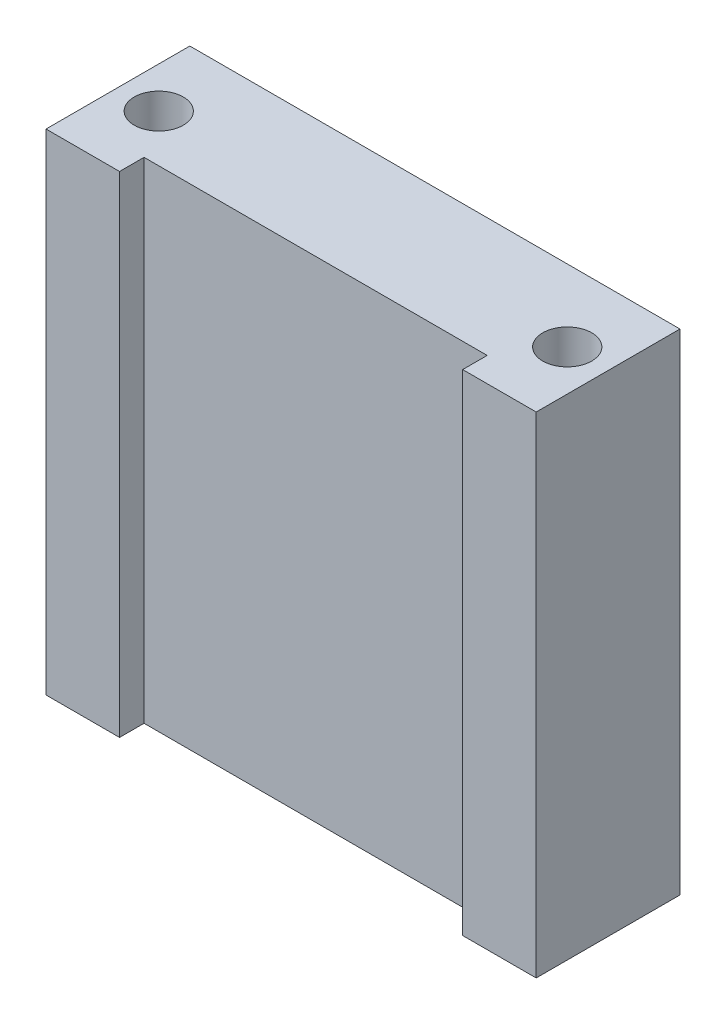
ISO-10303-21;
HEADER;
FILE_DESCRIPTION(('STEP AP214'),'2;1');
FILE_NAME('part.step','',(''),(''),'','','');
FILE_SCHEMA(('AUTOMOTIVE_DESIGN { 1 0 10303 214 1 1 1 1 }'));
ENDSEC;
DATA;
#1=APPLICATION_CONTEXT('core data for automotive mechanical design processes');
#2=APPLICATION_PROTOCOL_DEFINITION('international standard','automotive_design',2000,#1);
#3=PRODUCT_CONTEXT('',#1,'mechanical');
#4=PRODUCT('Part','Part','',(#3));
#5=PRODUCT_RELATED_PRODUCT_CATEGORY('part','',(#4));
#6=PRODUCT_DEFINITION_FORMATION('','',#4);
#7=PRODUCT_DEFINITION_CONTEXT('part definition',#1,'design');
#8=PRODUCT_DEFINITION('design','',#6,#7);
#9=PRODUCT_DEFINITION_SHAPE('','',#8);
#10=(LENGTH_UNIT() NAMED_UNIT(*) SI_UNIT(.MILLI.,.METRE.));
#11=(NAMED_UNIT(*) PLANE_ANGLE_UNIT() SI_UNIT($,.RADIAN.));
#12=(NAMED_UNIT(*) SI_UNIT($,.STERADIAN.) SOLID_ANGLE_UNIT());
#13=UNCERTAINTY_MEASURE_WITH_UNIT(LENGTH_MEASURE(1.E-05),#10,'distance_accuracy_value','');
#14=(GEOMETRIC_REPRESENTATION_CONTEXT(3) GLOBAL_UNCERTAINTY_ASSIGNED_CONTEXT((#13)) GLOBAL_UNIT_ASSIGNED_CONTEXT((#10,
#11,#12)) REPRESENTATION_CONTEXT('',''));
#15=CARTESIAN_POINT('',(0.,0.,0.));
#16=DIRECTION('',(0.,0.,1.));
#17=DIRECTION('',(1.,0.,0.));
#18=AXIS2_PLACEMENT_3D('',#15,#16,#17);
#19=CARTESIAN_POINT('',(0.,30.,4.4));
#20=DIRECTION('',(0.,0.,-1.));
#21=DIRECTION('',(-1.,0.,0.));
#22=AXIS2_PLACEMENT_3D('',#19,#20,#21);
#23=PLANE('',#22);
#24=DIRECTION('',(1.,0.,0.));
#25=VECTOR('',#24,1.);
#26=CARTESIAN_POINT('',(0.,0.,4.4));
#27=LINE('',#26,#25);
#28=CARTESIAN_POINT('',(-15.,0.,4.4));
#29=VERTEX_POINT('',#28);
#30=CARTESIAN_POINT('',(-10.5,0.,4.4));
#31=VERTEX_POINT('',#30);
#32=EDGE_CURVE('E156',#29,#31,#27,.T.);
#33=ORIENTED_EDGE('',*,*,#32,.T.);
#34=DIRECTION('',(0.,-1.,0.));
#35=VECTOR('',#34,1.);
#36=CARTESIAN_POINT('',(-10.5,30.,4.4));
#37=LINE('',#36,#35);
#38=CARTESIAN_POINT('',(-10.5,30.,4.4));
#39=VERTEX_POINT('',#38);
#40=EDGE_CURVE('E11',#39,#31,#37,.T.);
#41=ORIENTED_EDGE('',*,*,#40,.F.);
#42=DIRECTION('',(1.,0.,0.));
#43=VECTOR('',#42,1.);
#44=CARTESIAN_POINT('',(0.,30.,4.4));
#45=LINE('',#44,#43);
#46=CARTESIAN_POINT('',(-15.,30.,4.4));
#47=VERTEX_POINT('',#46);
#48=EDGE_CURVE('E189',#47,#39,#45,.T.);
#49=ORIENTED_EDGE('',*,*,#48,.F.);
#50=DIRECTION('',(0.,-1.,0.));
#51=VECTOR('',#50,1.);
#52=CARTESIAN_POINT('',(-15.,30.,4.4));
#53=LINE('',#52,#51);
#54=EDGE_CURVE('E61',#47,#29,#53,.T.);
#55=ORIENTED_EDGE('',*,*,#54,.T.);
#56=EDGE_LOOP('',(#33,#41,#49,#55));
#57=FACE_BOUND('',#56,.T.);
#58=ADVANCED_FACE('F43',(#57),#23,.F.);
#59=CARTESIAN_POINT('',(-10.5,30.,0.));
#60=DIRECTION('',(-1.,0.,0.));
#61=DIRECTION('',(0.,0.,1.));
#62=AXIS2_PLACEMENT_3D('',#59,#60,#61);
#63=PLANE('',#62);
#64=DIRECTION('',(0.,0.,-1.));
#65=VECTOR('',#64,1.);
#66=CARTESIAN_POINT('',(-10.5,0.,0.));
#67=LINE('',#66,#65);
#68=CARTESIAN_POINT('',(-10.5,0.,2.9));
#69=VERTEX_POINT('',#68);
#70=EDGE_CURVE('E159',#31,#69,#67,.T.);
#71=ORIENTED_EDGE('',*,*,#70,.T.);
#72=DIRECTION('',(0.,-1.,0.));
#73=VECTOR('',#72,1.);
#74=CARTESIAN_POINT('',(-10.5,30.,2.9));
#75=LINE('',#74,#73);
#76=CARTESIAN_POINT('',(-10.5,30.,2.9));
#77=VERTEX_POINT('',#76);
#78=EDGE_CURVE('E53',#77,#69,#75,.T.);
#79=ORIENTED_EDGE('',*,*,#78,.F.);
#80=DIRECTION('',(0.,0.,-1.));
#81=VECTOR('',#80,1.);
#82=CARTESIAN_POINT('',(-10.5,30.,0.));
#83=LINE('',#82,#81);
#84=EDGE_CURVE('E99',#39,#77,#83,.T.);
#85=ORIENTED_EDGE('',*,*,#84,.F.);
#86=ORIENTED_EDGE('',*,*,#40,.T.);
#87=EDGE_LOOP('',(#71,#79,#85,#86));
#88=FACE_BOUND('',#87,.T.);
#89=ADVANCED_FACE('F45',(#88),#63,.F.);
#90=CARTESIAN_POINT('',(0.,30.,2.9));
#91=DIRECTION('',(0.,0.,1.));
#92=DIRECTION('',(1.,0.,0.));
#93=AXIS2_PLACEMENT_3D('',#90,#91,#92);
#94=PLANE('',#93);
#95=DIRECTION('',(-1.,0.,0.));
#96=VECTOR('',#95,1.);
#97=CARTESIAN_POINT('',(0.,0.,2.9));
#98=LINE('',#97,#96);
#99=CARTESIAN_POINT('',(10.5,0.,2.9));
#100=VERTEX_POINT('',#99);
#101=EDGE_CURVE('E164',#100,#69,#98,.T.);
#102=ORIENTED_EDGE('',*,*,#101,.F.);
#103=DIRECTION('',(0.,-1.,0.));
#104=VECTOR('',#103,1.);
#105=CARTESIAN_POINT('',(10.5,30.,2.9));
#106=LINE('',#105,#104);
#107=CARTESIAN_POINT('',(10.5,30.,2.9));
#108=VERTEX_POINT('',#107);
#109=EDGE_CURVE('E199',#108,#100,#106,.T.);
#110=ORIENTED_EDGE('',*,*,#109,.F.);
#111=DIRECTION('',(-1.,0.,0.));
#112=VECTOR('',#111,1.);
#113=CARTESIAN_POINT('',(0.,30.,2.9));
#114=LINE('',#113,#112);
#115=EDGE_CURVE('E207',#108,#77,#114,.T.);
#116=ORIENTED_EDGE('',*,*,#115,.T.);
#117=ORIENTED_EDGE('',*,*,#78,.T.);
#118=EDGE_LOOP('',(#102,#110,#116,#117));
#119=FACE_BOUND('',#118,.T.);
#120=ADVANCED_FACE('F205',(#119),#94,.T.);
#121=CARTESIAN_POINT('',(10.5,30.,0.));
#122=DIRECTION('',(-1.,0.,0.));
#123=DIRECTION('',(0.,0.,1.));
#124=AXIS2_PLACEMENT_3D('',#121,#122,#123);
#125=PLANE('',#124);
#126=DIRECTION('',(0.,0.,-1.));
#127=VECTOR('',#126,1.);
#128=CARTESIAN_POINT('',(10.5,0.,0.));
#129=LINE('',#128,#127);
#130=CARTESIAN_POINT('',(10.5,0.,4.4));
#131=VERTEX_POINT('',#130);
#132=EDGE_CURVE('E168',#131,#100,#129,.T.);
#133=ORIENTED_EDGE('',*,*,#132,.F.);
#134=DIRECTION('',(0.,-1.,0.));
#135=VECTOR('',#134,1.);
#136=CARTESIAN_POINT('',(10.5,30.,4.4));
#137=LINE('',#136,#135);
#138=CARTESIAN_POINT('',(10.5,30.,4.4));
#139=VERTEX_POINT('',#138);
#140=EDGE_CURVE('E196',#139,#131,#137,.T.);
#141=ORIENTED_EDGE('',*,*,#140,.F.);
#142=DIRECTION('',(0.,0.,-1.));
#143=VECTOR('',#142,1.);
#144=CARTESIAN_POINT('',(10.5,30.,0.));
#145=LINE('',#144,#143);
#146=EDGE_CURVE('E217',#139,#108,#145,.T.);
#147=ORIENTED_EDGE('',*,*,#146,.T.);
#148=ORIENTED_EDGE('',*,*,#109,.T.);
#149=EDGE_LOOP('',(#133,#141,#147,#148));
#150=FACE_BOUND('',#149,.T.);
#151=ADVANCED_FACE('F215',(#150),#125,.T.);
#152=CARTESIAN_POINT('',(15.,0.,4.4));
#153=VERTEX_POINT('',#152);
#154=EDGE_CURVE('E160',#131,#153,#27,.T.);
#155=ORIENTED_EDGE('',*,*,#154,.T.);
#156=DIRECTION('',(0.,-1.,0.));
#157=VECTOR('',#156,1.);
#158=CARTESIAN_POINT('',(15.,30.,4.4));
#159=LINE('',#158,#157);
#160=CARTESIAN_POINT('',(15.,30.,4.4));
#161=VERTEX_POINT('',#160);
#162=EDGE_CURVE('E138',#161,#153,#159,.T.);
#163=ORIENTED_EDGE('',*,*,#162,.F.);
#164=EDGE_CURVE('E124',#139,#161,#45,.T.);
#165=ORIENTED_EDGE('',*,*,#164,.F.);
#166=ORIENTED_EDGE('',*,*,#140,.T.);
#167=EDGE_LOOP('',(#155,#163,#165,#166));
#168=FACE_BOUND('',#167,.T.);
#169=ADVANCED_FACE('F242',(#168),#23,.F.);
#170=CARTESIAN_POINT('',(15.,30.,0.));
#171=DIRECTION('',(-1.,0.,0.));
#172=DIRECTION('',(0.,0.,1.));
#173=AXIS2_PLACEMENT_3D('',#170,#171,#172);
#174=PLANE('',#173);
#175=DIRECTION('',(0.,0.,-1.));
#176=VECTOR('',#175,1.);
#177=CARTESIAN_POINT('',(15.,0.,0.));
#178=LINE('',#177,#176);
#179=CARTESIAN_POINT('',(15.,0.,-4.4));
#180=VERTEX_POINT('',#179);
#181=EDGE_CURVE('E134',#153,#180,#178,.T.);
#182=ORIENTED_EDGE('',*,*,#181,.T.);
#183=DIRECTION('',(0.,-1.,0.));
#184=VECTOR('',#183,1.);
#185=CARTESIAN_POINT('',(15.,30.,-4.4));
#186=LINE('',#185,#184);
#187=CARTESIAN_POINT('',(15.,30.,-4.4));
#188=VERTEX_POINT('',#187);
#189=EDGE_CURVE('E131',#188,#180,#186,.T.);
#190=ORIENTED_EDGE('',*,*,#189,.F.);
#191=DIRECTION('',(0.,0.,-1.));
#192=VECTOR('',#191,1.);
#193=CARTESIAN_POINT('',(15.,30.,0.));
#194=LINE('',#193,#192);
#195=EDGE_CURVE('E115',#161,#188,#194,.T.);
#196=ORIENTED_EDGE('',*,*,#195,.F.);
#197=ORIENTED_EDGE('',*,*,#162,.T.);
#198=EDGE_LOOP('',(#182,#190,#196,#197));
#199=FACE_BOUND('',#198,.T.);
#200=ADVANCED_FACE('F132',(#199),#174,.F.);
#201=CARTESIAN_POINT('',(0.,30.,-4.4));
#202=DIRECTION('',(0.,0.,-1.));
#203=DIRECTION('',(-1.,0.,0.));
#204=AXIS2_PLACEMENT_3D('',#201,#202,#203);
#205=PLANE('',#204);
#206=DIRECTION('',(1.,0.,0.));
#207=VECTOR('',#206,1.);
#208=CARTESIAN_POINT('',(0.,0.,-4.4));
#209=LINE('',#208,#207);
#210=CARTESIAN_POINT('',(-15.,0.,-4.4));
#211=VERTEX_POINT('',#210);
#212=EDGE_CURVE('E174',#211,#180,#209,.T.);
#213=ORIENTED_EDGE('',*,*,#212,.F.);
#214=DIRECTION('',(0.,-1.,0.));
#215=VECTOR('',#214,1.);
#216=CARTESIAN_POINT('',(-15.,30.,-4.4));
#217=LINE('',#216,#215);
#218=CARTESIAN_POINT('',(-15.,30.,-4.4));
#219=VERTEX_POINT('',#218);
#220=EDGE_CURVE('E87',#219,#211,#217,.T.);
#221=ORIENTED_EDGE('',*,*,#220,.F.);
#222=DIRECTION('',(1.,0.,0.));
#223=VECTOR('',#222,1.);
#224=CARTESIAN_POINT('',(0.,30.,-4.4));
#225=LINE('',#224,#223);
#226=EDGE_CURVE('E121',#219,#188,#225,.T.);
#227=ORIENTED_EDGE('',*,*,#226,.T.);
#228=ORIENTED_EDGE('',*,*,#189,.T.);
#229=EDGE_LOOP('',(#213,#221,#227,#228));
#230=FACE_BOUND('',#229,.T.);
#231=ADVANCED_FACE('F140',(#230),#205,.T.);
#232=CARTESIAN_POINT('',(-12.5,30.,0.));
#233=DIRECTION('',(0.,-1.,0.));
#234=DIRECTION('',(0.,0.,-1.));
#235=AXIS2_PLACEMENT_3D('',#232,#233,#234);
#236=CYLINDRICAL_SURFACE('',#235,1.5);
#237=CARTESIAN_POINT('',(-12.5,30.,0.));
#238=DIRECTION('',(0.,1.,0.));
#239=DIRECTION('',(0.,0.,1.));
#240=AXIS2_PLACEMENT_3D('',#237,#238,#239);
#241=CIRCLE('',#240,1.5);
#242=CARTESIAN_POINT('',(-12.5,30.,1.5));
#243=VERTEX_POINT('',#242);
#244=EDGE_CURVE('E145',#243,#243,#241,.T.);
#245=ORIENTED_EDGE('',*,*,#244,.T.);
#246=EDGE_LOOP('',(#245));
#247=FACE_BOUND('',#246,.T.);
#248=CARTESIAN_POINT('',(-12.5,0.,0.));
#249=DIRECTION('',(0.,1.,0.));
#250=DIRECTION('',(0.,0.,1.));
#251=AXIS2_PLACEMENT_3D('',#248,#249,#250);
#252=CIRCLE('',#251,1.5);
#253=CARTESIAN_POINT('',(-12.5,0.,1.5));
#254=VERTEX_POINT('',#253);
#255=EDGE_CURVE('E181',#254,#254,#252,.T.);
#256=ORIENTED_EDGE('',*,*,#255,.F.);
#257=EDGE_LOOP('',(#256));
#258=FACE_BOUND('',#257,.T.);
#259=ADVANCED_FACE('F229',(#247,#258),#236,.F.);
#260=CARTESIAN_POINT('',(-15.,30.,0.));
#261=DIRECTION('',(-1.,0.,0.));
#262=DIRECTION('',(0.,0.,1.));
#263=AXIS2_PLACEMENT_3D('',#260,#261,#262);
#264=PLANE('',#263);
#265=DIRECTION('',(0.,0.,-1.));
#266=VECTOR('',#265,1.);
#267=CARTESIAN_POINT('',(-15.,0.,0.));
#268=LINE('',#267,#266);
#269=EDGE_CURVE('E177',#29,#211,#268,.T.);
#270=ORIENTED_EDGE('',*,*,#269,.F.);
#271=ORIENTED_EDGE('',*,*,#54,.F.);
#272=DIRECTION('',(0.,0.,-1.));
#273=VECTOR('',#272,1.);
#274=CARTESIAN_POINT('',(-15.,30.,0.));
#275=LINE('',#274,#273);
#276=EDGE_CURVE('E142',#47,#219,#275,.T.);
#277=ORIENTED_EDGE('',*,*,#276,.T.);
#278=ORIENTED_EDGE('',*,*,#220,.T.);
#279=EDGE_LOOP('',(#270,#271,#277,#278));
#280=FACE_BOUND('',#279,.T.);
#281=ADVANCED_FACE('F226',(#280),#264,.T.);
#282=CARTESIAN_POINT('',(12.5,30.,0.));
#283=DIRECTION('',(0.,-1.,0.));
#284=DIRECTION('',(0.,0.,-1.));
#285=AXIS2_PLACEMENT_3D('',#282,#283,#284);
#286=CYLINDRICAL_SURFACE('',#285,1.5);
#287=CARTESIAN_POINT('',(12.5,30.,0.));
#288=DIRECTION('',(0.,1.,0.));
#289=DIRECTION('',(0.,0.,1.));
#290=AXIS2_PLACEMENT_3D('',#287,#288,#289);
#291=CIRCLE('',#290,1.5);
#292=CARTESIAN_POINT('',(12.5,30.,1.5));
#293=VERTEX_POINT('',#292);
#294=EDGE_CURVE('E152',#293,#293,#291,.F.);
#295=ORIENTED_EDGE('',*,*,#294,.F.);
#296=EDGE_LOOP('',(#295));
#297=FACE_BOUND('',#296,.T.);
#298=CARTESIAN_POINT('',(12.5,0.,0.));
#299=DIRECTION('',(0.,1.,0.));
#300=DIRECTION('',(0.,0.,1.));
#301=AXIS2_PLACEMENT_3D('',#298,#299,#300);
#302=CIRCLE('',#301,1.5);
#303=CARTESIAN_POINT('',(12.5,0.,1.5));
#304=VERTEX_POINT('',#303);
#305=EDGE_CURVE('E185',#304,#304,#302,.F.);
#306=ORIENTED_EDGE('',*,*,#305,.T.);
#307=EDGE_LOOP('',(#306));
#308=FACE_BOUND('',#307,.T.);
#309=ADVANCED_FACE('F228',(#297,#308),#286,.F.);
#310=CARTESIAN_POINT('',(0.,30.,0.));
#311=DIRECTION('',(0.,1.,0.));
#312=DIRECTION('',(0.,0.,1.));
#313=AXIS2_PLACEMENT_3D('',#310,#311,#312);
#314=PLANE('',#313);
#315=ORIENTED_EDGE('',*,*,#48,.T.);
#316=ORIENTED_EDGE('',*,*,#84,.T.);
#317=ORIENTED_EDGE('',*,*,#115,.F.);
#318=ORIENTED_EDGE('',*,*,#146,.F.);
#319=ORIENTED_EDGE('',*,*,#164,.T.);
#320=ORIENTED_EDGE('',*,*,#195,.T.);
#321=ORIENTED_EDGE('',*,*,#226,.F.);
#322=ORIENTED_EDGE('',*,*,#276,.F.);
#323=EDGE_LOOP('',(#315,#316,#317,#318,#319,#320,#321,#322));
#324=FACE_BOUND('',#323,.T.);
#325=ORIENTED_EDGE('',*,*,#244,.F.);
#326=EDGE_LOOP('',(#325));
#327=FACE_BOUND('',#326,.T.);
#328=ORIENTED_EDGE('',*,*,#294,.T.);
#329=EDGE_LOOP('',(#328));
#330=FACE_BOUND('',#329,.T.);
#331=ADVANCED_FACE('F117',(#324,#327,#330),#314,.T.);
#332=CARTESIAN_POINT('',(0.,0.,0.));
#333=DIRECTION('',(0.,1.,0.));
#334=DIRECTION('',(0.,0.,1.));
#335=AXIS2_PLACEMENT_3D('',#332,#333,#334);
#336=PLANE('',#335);
#337=ORIENTED_EDGE('',*,*,#32,.F.);
#338=ORIENTED_EDGE('',*,*,#269,.T.);
#339=ORIENTED_EDGE('',*,*,#212,.T.);
#340=ORIENTED_EDGE('',*,*,#181,.F.);
#341=ORIENTED_EDGE('',*,*,#154,.F.);
#342=ORIENTED_EDGE('',*,*,#132,.T.);
#343=ORIENTED_EDGE('',*,*,#101,.T.);
#344=ORIENTED_EDGE('',*,*,#70,.F.);
#345=EDGE_LOOP('',(#337,#338,#339,#340,#341,#342,#343,#344));
#346=FACE_BOUND('',#345,.T.);
#347=ORIENTED_EDGE('',*,*,#255,.T.);
#348=EDGE_LOOP('',(#347));
#349=FACE_BOUND('',#348,.T.);
#350=ORIENTED_EDGE('',*,*,#305,.F.);
#351=EDGE_LOOP('',(#350));
#352=FACE_BOUND('',#351,.T.);
#353=ADVANCED_FACE('F210',(#346,#349,#352),#336,.F.);
#354=CLOSED_SHELL('',(#58,#89,#120,#151,#169,#200,#231,#259,#281,#309,#331,#353));
#355=MANIFOLD_SOLID_BREP('B2',#354);
#356=ADVANCED_BREP_SHAPE_REPRESENTATION('',(#18,#355),#14);
#357=SHAPE_DEFINITION_REPRESENTATION(#9,#356);
ENDSEC;
END-ISO-10303-21;
